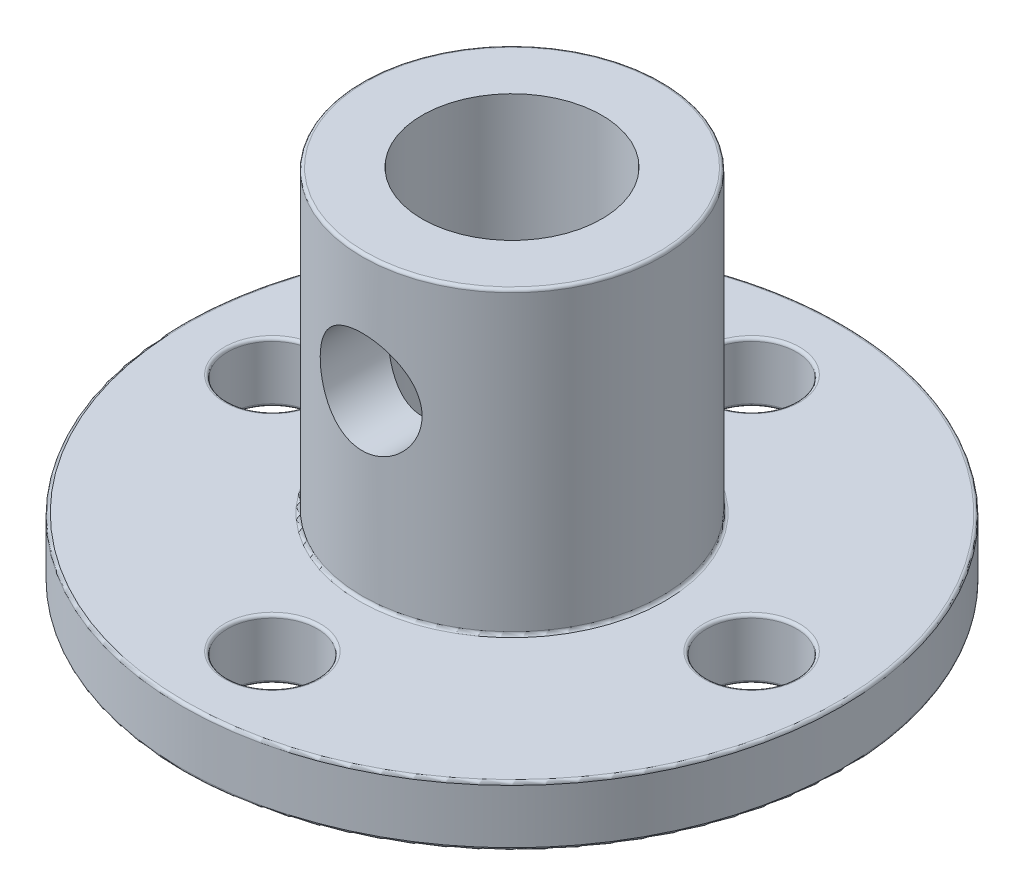
ISO-10303-21;
HEADER;
FILE_DESCRIPTION(('STEP AP214'),'2;1');
FILE_NAME('part.step','',(''),(''),'','','');
FILE_SCHEMA(('AUTOMOTIVE_DESIGN { 1 0 10303 214 1 1 1 1 }'));
ENDSEC;
DATA;
#1=APPLICATION_CONTEXT('core data for automotive mechanical design processes');
#2=APPLICATION_PROTOCOL_DEFINITION('international standard','automotive_design',2000,#1);
#3=PRODUCT_CONTEXT('',#1,'mechanical');
#4=PRODUCT('Part','Part','',(#3));
#5=PRODUCT_RELATED_PRODUCT_CATEGORY('part','',(#4));
#6=PRODUCT_DEFINITION_FORMATION('','',#4);
#7=PRODUCT_DEFINITION_CONTEXT('part definition',#1,'design');
#8=PRODUCT_DEFINITION('design','',#6,#7);
#9=PRODUCT_DEFINITION_SHAPE('','',#8);
#10=(LENGTH_UNIT() NAMED_UNIT(*) SI_UNIT(.MILLI.,.METRE.));
#11=(NAMED_UNIT(*) PLANE_ANGLE_UNIT() SI_UNIT($,.RADIAN.));
#12=(NAMED_UNIT(*) SI_UNIT($,.STERADIAN.) SOLID_ANGLE_UNIT());
#13=UNCERTAINTY_MEASURE_WITH_UNIT(LENGTH_MEASURE(1.E-05),#10,'distance_accuracy_value','');
#14=(GEOMETRIC_REPRESENTATION_CONTEXT(3) GLOBAL_UNCERTAINTY_ASSIGNED_CONTEXT((#13)) GLOBAL_UNIT_ASSIGNED_CONTEXT((#10,
#11,#12)) REPRESENTATION_CONTEXT('',''));
#15=CARTESIAN_POINT('',(0.,0.,0.));
#16=DIRECTION('',(0.,0.,1.));
#17=DIRECTION('',(1.,0.,0.));
#18=AXIS2_PLACEMENT_3D('',#15,#16,#17);
#19=CARTESIAN_POINT('',(0.,2.,0.));
#20=DIRECTION('',(0.,-1.,0.));
#21=DIRECTION('',(0.,0.,-1.));
#22=AXIS2_PLACEMENT_3D('',#19,#20,#21);
#23=CYLINDRICAL_SURFACE('',#22,11.);
#24=CARTESIAN_POINT('',(0.,0.1,0.));
#25=DIRECTION('',(0.,1.,0.));
#26=DIRECTION('',(0.,0.,1.));
#27=AXIS2_PLACEMENT_3D('',#24,#25,#26);
#28=CIRCLE('',#27,11.);
#29=CARTESIAN_POINT('',(0.,0.1,11.));
#30=VERTEX_POINT('',#29);
#31=EDGE_CURVE('E55',#30,#30,#28,.T.);
#32=ORIENTED_EDGE('',*,*,#31,.T.);
#33=EDGE_LOOP('',(#32));
#34=FACE_BOUND('',#33,.T.);
#35=CARTESIAN_POINT('',(0.,1.9,0.));
#36=DIRECTION('',(0.,1.,0.));
#37=DIRECTION('',(0.,0.,1.));
#38=AXIS2_PLACEMENT_3D('',#35,#36,#37);
#39=CIRCLE('',#38,11.);
#40=CARTESIAN_POINT('',(0.,1.9,11.));
#41=VERTEX_POINT('',#40);
#42=EDGE_CURVE('E61',#41,#41,#39,.F.);
#43=ORIENTED_EDGE('',*,*,#42,.T.);
#44=EDGE_LOOP('',(#43));
#45=FACE_BOUND('',#44,.T.);
#46=ADVANCED_FACE('F37',(#34,#45),#23,.T.);
#47=CARTESIAN_POINT('',(0.,2.,0.));
#48=DIRECTION('',(0.,1.,0.));
#49=DIRECTION('',(0.,0.,1.));
#50=AXIS2_PLACEMENT_3D('',#47,#48,#49);
#51=PLANE('',#50);
#52=CARTESIAN_POINT('',(0.,2.,-8.));
#53=DIRECTION('',(0.,1.,0.));
#54=DIRECTION('',(0.,0.,1.));
#55=AXIS2_PLACEMENT_3D('',#52,#53,#54);
#56=CIRCLE('',#55,1.6);
#57=CARTESIAN_POINT('',(0.,2.,-6.4));
#58=VERTEX_POINT('',#57);
#59=EDGE_CURVE('E109',#58,#58,#56,.F.);
#60=ORIENTED_EDGE('',*,*,#59,.T.);
#61=EDGE_LOOP('',(#60));
#62=FACE_BOUND('',#61,.T.);
#63=CARTESIAN_POINT('',(8.,2.,0.));
#64=DIRECTION('',(0.,1.,0.));
#65=DIRECTION('',(0.,0.,1.));
#66=AXIS2_PLACEMENT_3D('',#63,#64,#65);
#67=CIRCLE('',#66,1.6);
#68=CARTESIAN_POINT('',(8.,2.,1.60000000000008));
#69=VERTEX_POINT('',#68);
#70=EDGE_CURVE('E113',#69,#69,#67,.F.);
#71=ORIENTED_EDGE('',*,*,#70,.T.);
#72=EDGE_LOOP('',(#71));
#73=FACE_BOUND('',#72,.T.);
#74=CARTESIAN_POINT('',(0.,2.,8.));
#75=DIRECTION('',(0.,1.,0.));
#76=DIRECTION('',(0.,0.,1.));
#77=AXIS2_PLACEMENT_3D('',#74,#75,#76);
#78=CIRCLE('',#77,1.6);
#79=CARTESIAN_POINT('',(0.,2.,9.6));
#80=VERTEX_POINT('',#79);
#81=EDGE_CURVE('E117',#80,#80,#78,.F.);
#82=ORIENTED_EDGE('',*,*,#81,.T.);
#83=EDGE_LOOP('',(#82));
#84=FACE_BOUND('',#83,.T.);
#85=CARTESIAN_POINT('',(-8.,2.,0.));
#86=DIRECTION('',(0.,1.,0.));
#87=DIRECTION('',(0.,0.,1.));
#88=AXIS2_PLACEMENT_3D('',#85,#86,#87);
#89=CIRCLE('',#88,1.6);
#90=CARTESIAN_POINT('',(-8.,2.,1.59999999999997));
#91=VERTEX_POINT('',#90);
#92=EDGE_CURVE('E121',#91,#91,#89,.F.);
#93=ORIENTED_EDGE('',*,*,#92,.T.);
#94=EDGE_LOOP('',(#93));
#95=FACE_BOUND('',#94,.T.);
#96=CARTESIAN_POINT('',(0.,2.,0.));
#97=DIRECTION('',(0.,1.,0.));
#98=DIRECTION('',(0.,0.,1.));
#99=AXIS2_PLACEMENT_3D('',#96,#97,#98);
#100=CIRCLE('',#99,5.1);
#101=CARTESIAN_POINT('',(0.,2.,5.1));
#102=VERTEX_POINT('',#101);
#103=EDGE_CURVE('E125',#102,#102,#100,.F.);
#104=ORIENTED_EDGE('',*,*,#103,.T.);
#105=EDGE_LOOP('',(#104));
#106=FACE_BOUND('',#105,.T.);
#107=CARTESIAN_POINT('',(0.,2.,0.));
#108=DIRECTION('',(0.,1.,0.));
#109=DIRECTION('',(0.,0.,1.));
#110=AXIS2_PLACEMENT_3D('',#107,#108,#109);
#111=CIRCLE('',#110,10.9);
#112=CARTESIAN_POINT('',(0.,2.,10.9));
#113=VERTEX_POINT('',#112);
#114=EDGE_CURVE('E129',#113,#113,#111,.T.);
#115=ORIENTED_EDGE('',*,*,#114,.T.);
#116=EDGE_LOOP('',(#115));
#117=FACE_BOUND('',#116,.T.);
#118=ADVANCED_FACE('F203',(#62,#73,#84,#95,#106,#117),#51,.T.);
#119=CARTESIAN_POINT('',(0.,0.,0.));
#120=DIRECTION('',(0.,1.,0.));
#121=DIRECTION('',(0.,0.,1.));
#122=AXIS2_PLACEMENT_3D('',#119,#120,#121);
#123=PLANE('',#122);
#124=CARTESIAN_POINT('',(0.,0.,-8.));
#125=DIRECTION('',(0.,1.,0.));
#126=DIRECTION('',(0.,0.,1.));
#127=AXIS2_PLACEMENT_3D('',#124,#125,#126);
#128=CIRCLE('',#127,1.6);
#129=CARTESIAN_POINT('',(0.,0.,-6.4));
#130=VERTEX_POINT('',#129);
#131=EDGE_CURVE('E89',#130,#130,#128,.T.);
#132=ORIENTED_EDGE('',*,*,#131,.T.);
#133=EDGE_LOOP('',(#132));
#134=FACE_BOUND('',#133,.T.);
#135=CARTESIAN_POINT('',(8.,0.,0.));
#136=DIRECTION('',(0.,1.,0.));
#137=DIRECTION('',(0.,0.,1.));
#138=AXIS2_PLACEMENT_3D('',#135,#136,#137);
#139=CIRCLE('',#138,1.6);
#140=CARTESIAN_POINT('',(8.,0.,1.60000000000008));
#141=VERTEX_POINT('',#140);
#142=EDGE_CURVE('E93',#141,#141,#139,.T.);
#143=ORIENTED_EDGE('',*,*,#142,.T.);
#144=EDGE_LOOP('',(#143));
#145=FACE_BOUND('',#144,.T.);
#146=CARTESIAN_POINT('',(0.,0.,8.));
#147=DIRECTION('',(0.,1.,0.));
#148=DIRECTION('',(0.,0.,1.));
#149=AXIS2_PLACEMENT_3D('',#146,#147,#148);
#150=CIRCLE('',#149,1.6);
#151=CARTESIAN_POINT('',(0.,0.,9.6));
#152=VERTEX_POINT('',#151);
#153=EDGE_CURVE('E97',#152,#152,#150,.T.);
#154=ORIENTED_EDGE('',*,*,#153,.T.);
#155=EDGE_LOOP('',(#154));
#156=FACE_BOUND('',#155,.T.);
#157=CARTESIAN_POINT('',(-8.,0.,0.));
#158=DIRECTION('',(0.,1.,0.));
#159=DIRECTION('',(0.,0.,1.));
#160=AXIS2_PLACEMENT_3D('',#157,#158,#159);
#161=CIRCLE('',#160,1.6);
#162=CARTESIAN_POINT('',(-8.,0.,1.59999999999997));
#163=VERTEX_POINT('',#162);
#164=EDGE_CURVE('E101',#163,#163,#161,.T.);
#165=ORIENTED_EDGE('',*,*,#164,.T.);
#166=EDGE_LOOP('',(#165));
#167=FACE_BOUND('',#166,.T.);
#168=CARTESIAN_POINT('',(0.,0.,0.));
#169=DIRECTION('',(0.,1.,0.));
#170=DIRECTION('',(0.,0.,1.));
#171=AXIS2_PLACEMENT_3D('',#168,#169,#170);
#172=CIRCLE('',#171,10.9);
#173=CARTESIAN_POINT('',(0.,0.,10.9));
#174=VERTEX_POINT('',#173);
#175=EDGE_CURVE('E105',#174,#174,#172,.F.);
#176=ORIENTED_EDGE('',*,*,#175,.T.);
#177=EDGE_LOOP('',(#176));
#178=FACE_BOUND('',#177,.T.);
#179=CARTESIAN_POINT('',(0.,0.,0.));
#180=DIRECTION('',(0.,1.,0.));
#181=DIRECTION('',(0.,0.,1.));
#182=AXIS2_PLACEMENT_3D('',#179,#180,#181);
#183=CIRCLE('',#182,3.);
#184=CARTESIAN_POINT('',(0.,0.,3.));
#185=VERTEX_POINT('',#184);
#186=EDGE_CURVE('E141',#185,#185,#183,.T.);
#187=ORIENTED_EDGE('',*,*,#186,.T.);
#188=EDGE_LOOP('',(#187));
#189=FACE_BOUND('',#188,.T.);
#190=ADVANCED_FACE('F199',(#134,#145,#156,#167,#178,#189),#123,.F.);
#191=CARTESIAN_POINT('',(0.,12.,0.));
#192=DIRECTION('',(0.,-1.,0.));
#193=DIRECTION('',(0.,0.,-1.));
#194=AXIS2_PLACEMENT_3D('',#191,#192,#193);
#195=CYLINDRICAL_SURFACE('',#194,5.);
#196=CARTESIAN_POINT('',(1.69999999999999,8.,4.7021271782035));
#197=CARTESIAN_POINT('',(1.70000083454375,7.90752328975831,4.70212652194256));
#198=CARTESIAN_POINT('',(1.69242870923651,7.81505224444068,4.70488508126443));
#199=CARTESIAN_POINT('',(1.66244775059742,7.6328572377474,4.71556097706198));
#200=CARTESIAN_POINT('',(1.64003696400668,7.54313363965373,4.72347899269067));
#201=CARTESIAN_POINT('',(1.58126291046388,7.36910391544352,4.7434754891435));
#202=CARTESIAN_POINT('',(1.54492788897221,7.28478722293931,4.75554554247406));
#203=CARTESIAN_POINT('',(1.45943386286845,7.12341804583153,4.78247366817093));
#204=CARTESIAN_POINT('',(1.41027185367261,7.04636726895504,4.79733239352443));
#205=CARTESIAN_POINT('',(1.2983746719467,6.89857913546177,4.82884222933476));
#206=CARTESIAN_POINT('',(1.23520476543085,6.82818065203456,4.84553930456831));
#207=CARTESIAN_POINT('',(1.09801191148952,6.69874435129835,4.87845678431022));
#208=CARTESIAN_POINT('',(1.02398714442389,6.63970844258409,4.8946771083507));
#209=CARTESIAN_POINT('',(0.864693432862369,6.5331212255404,4.92534783339618));
#210=CARTESIAN_POINT('',(0.779172907362995,6.48592700656457,4.93973790593414));
#211=CARTESIAN_POINT('',(0.600833256277233,6.4067295955546,4.96458352458178));
#212=CARTESIAN_POINT('',(0.508016191005185,6.37472213308829,4.97504017657606));
#213=CARTESIAN_POINT('',(0.321272723570076,6.32796192600481,4.99051509444579));
#214=CARTESIAN_POINT('',(0.227507209637129,6.31262822616442,4.99571598750179));
#215=CARTESIAN_POINT('',(0.0385994725331013,6.2978014121833,5.00074274740375));
#216=CARTESIAN_POINT('',(-0.0565423749459008,6.29830405387371,5.00057005438089));
#217=CARTESIAN_POINT('',(-0.241382097771989,6.31477175114398,4.99499170747059));
#218=CARTESIAN_POINT('',(-0.331143746450025,6.3301053455759,4.98979976393553));
#219=CARTESIAN_POINT('',(-0.506734255470696,6.3747527069175,4.9750364341854));
#220=CARTESIAN_POINT('',(-0.59256284621597,6.40406743061818,4.96546474824686));
#221=CARTESIAN_POINT('',(-0.75920656134227,6.47620165201555,4.9427500710043));
#222=CARTESIAN_POINT('',(-0.839939033628107,6.51919695472472,4.92956091559001));
#223=CARTESIAN_POINT('',(-0.993226636814275,6.61732550429228,4.90097842010093));
#224=CARTESIAN_POINT('',(-1.06577942162155,6.67246222021983,4.88558445050251));
#225=CARTESIAN_POINT('',(-1.20439996959723,6.79646981206153,4.85332192905628));
#226=CARTESIAN_POINT('',(-1.26997767595032,6.86588010712957,4.83641807912284));
#227=CARTESIAN_POINT('',(-1.38872493069964,7.01485104493052,4.80367011822786));
#228=CARTESIAN_POINT('',(-1.44189240256894,7.09441338290158,4.78782618493151));
#229=CARTESIAN_POINT('',(-1.53502589229707,7.26303997150578,4.75879407140505));
#230=CARTESIAN_POINT('',(-1.57477659354932,7.35223139968969,4.74565042127558));
#231=CARTESIAN_POINT('',(-1.63852535861583,7.536602288434,4.72402172661412));
#232=CARTESIAN_POINT('',(-1.66253034568802,7.63177909707254,4.71553463490143));
#233=CARTESIAN_POINT('',(-1.69309083890646,7.82065603849394,4.70464619656837));
#234=CARTESIAN_POINT('',(-1.70040916615749,7.91421742410798,4.70197905671105));
#235=CARTESIAN_POINT('',(-1.69955565307547,8.10124961809406,4.70228801878616));
#236=CARTESIAN_POINT('',(-1.6913867740242,8.19472044036349,4.70526304189047));
#237=CARTESIAN_POINT('',(-1.66047724893075,8.37538355218379,4.71625534392992));
#238=CARTESIAN_POINT('',(-1.63827542017045,8.46268061675481,4.72408598154745));
#239=CARTESIAN_POINT('',(-1.58058151574919,8.63228971501207,4.74369940014614));
#240=CARTESIAN_POINT('',(-1.54508702470011,8.71460083955142,4.75548289935478));
#241=CARTESIAN_POINT('',(-1.46049899203864,8.87488375226898,4.78215067653987));
#242=CARTESIAN_POINT('',(-1.4109989860438,8.95262586296178,4.79712369407796));
#243=CARTESIAN_POINT('',(-1.30026121895316,9.09897548811651,4.82831489840599));
#244=CARTESIAN_POINT('',(-1.23901986418284,9.16758019497026,4.84453346550791));
#245=CARTESIAN_POINT('',(-1.10287590057702,9.29728191788624,4.8773765903905));
#246=CARTESIAN_POINT('',(-1.02744048224684,9.35782657762009,4.89398043774981));
#247=CARTESIAN_POINT('',(-0.867071356511241,9.46543835734577,4.92492097197535));
#248=CARTESIAN_POINT('',(-0.782137944357915,9.51250589612193,4.93925772928231));
#249=CARTESIAN_POINT('',(-0.605562992499803,9.59140881407607,4.96398853333037));
#250=CARTESIAN_POINT('',(-0.513967041076656,9.62333820506572,4.97440682887351));
#251=CARTESIAN_POINT('',(-0.326279600958924,9.67120054667826,4.99022992286064));
#252=CARTESIAN_POINT('',(-0.230189822477591,9.68713953173943,4.99563661251921));
#253=CARTESIAN_POINT('',(-0.0412847320444337,9.70200838968725,5.00067886842801));
#254=CARTESIAN_POINT('',(0.0514617684068306,9.70172977552556,5.00058299503759));
#255=CARTESIAN_POINT('',(0.235524998701214,9.68613660256515,4.99529808648695));
#256=CARTESIAN_POINT('',(0.326841851834332,9.670823347662,4.99010949299845));
#257=CARTESIAN_POINT('',(0.503894933746095,9.62612656364102,4.97532468724919));
#258=CARTESIAN_POINT('',(0.589699849092416,9.59698787569877,4.96580528761005));
#259=CARTESIAN_POINT('',(0.755232625464402,9.52569632870286,4.94333981389634));
#260=CARTESIAN_POINT('',(0.834959370027396,9.48354108586364,4.93039311222516));
#261=CARTESIAN_POINT('',(0.989365962188499,9.38557875468782,4.90179107732748));
#262=CARTESIAN_POINT('',(1.06374043677656,9.32931521420284,4.88605174991667));
#263=CARTESIAN_POINT('',(1.20224900233287,9.20550072879636,4.85382976209564));
#264=CARTESIAN_POINT('',(1.26637974652637,9.13794610960774,4.83734686099555));
#265=CARTESIAN_POINT('',(1.38527108066895,8.9901427709675,4.80468376561511));
#266=CARTESIAN_POINT('',(1.43953691950701,8.90948580103271,4.78854400376067));
#267=CARTESIAN_POINT('',(1.53371304894745,8.73969115347826,4.75921932721247));
#268=CARTESIAN_POINT('',(1.57362636225987,8.65055526656511,4.74603379056559));
#269=CARTESIAN_POINT('',(1.63670315378203,8.46917424219347,4.72464649214224));
#270=CARTESIAN_POINT('',(1.66035870443536,8.37711798675454,4.71629964142924));
#271=CARTESIAN_POINT('',(1.69200369351248,8.19003839236571,4.70504136429291));
#272=CARTESIAN_POINT('',(1.6999991425389,8.09501620602082,4.70212785248597));
#273=CARTESIAN_POINT('',(1.69999999999999,8.,4.7021271782035));
#274=B_SPLINE_CURVE_WITH_KNOTS('',3,(#196,#197,#198,#199,#200,#201,#202,#203,#204,#205,#206,
#207,#208,#209,#210,#211,#212,#213,#214,#215,#216,#217,#218,#219,#220,#221,#222,#223,#224,#225,
#226,#227,#228,#229,#230,#231,#232,#233,#234,#235,#236,#237,#238,#239,#240,#241,#242,#243,#244,
#245,#246,#247,#248,#249,#250,#251,#252,#253,#254,#255,#256,#257,#258,#259,#260,#261,#262,#263,
#264,#265,#266,#267,#268,#269,#270,#271,#272,#273),.UNSPECIFIED.,.T.,.F.,(4,2,2,2,2,2,2,2,2,2,2,
2,2,2,2,2,2,2,2,2,2,2,2,2,2,2,2,2,2,2,2,2,2,2,2,2,2,2,4),(0.,0.277077968153845,
0.554192416190846,0.830747684942294,1.10736779203619,1.39421810283561,1.68111655449405,
1.97583876744143,2.27047805694105,2.55448535632962,2.83841654188374,3.11076776810837,
3.38313763521629,3.65915950263529,3.93526033814754,4.22485132673056,4.51449073608343,
4.8085789773331,5.10253782362637,5.38276332934061,5.66293525902721,5.93295361109327,
6.20302105158153,6.48191321620708,6.7608908780218,7.05392324511245,7.34694650560805,
7.63812537455788,7.92919431742889,8.20606990660463,8.48292148556452,8.75504342249778,
9.02721522404264,9.30969191167984,9.59226070059482,9.88646828974928,10.1806138810487,
10.4654099966659,10.750096781448),.UNSPECIFIED.);
#275=CARTESIAN_POINT('',(1.69999999999999,8.,4.7021271782035));
#276=VERTEX_POINT('',#275);
#277=EDGE_CURVE('E146',#276,#276,#274,.T.);
#278=ORIENTED_EDGE('',*,*,#277,.T.);
#279=EDGE_LOOP('',(#278));
#280=FACE_BOUND('',#279,.T.);
#281=CARTESIAN_POINT('',(0.,2.1,0.));
#282=DIRECTION('',(0.,1.,0.));
#283=DIRECTION('',(0.,0.,1.));
#284=AXIS2_PLACEMENT_3D('',#281,#282,#283);
#285=CIRCLE('',#284,5.);
#286=CARTESIAN_POINT('',(0.,2.1,5.));
#287=VERTEX_POINT('',#286);
#288=EDGE_CURVE('E45',#287,#287,#285,.T.);
#289=ORIENTED_EDGE('',*,*,#288,.T.);
#290=EDGE_LOOP('',(#289));
#291=FACE_BOUND('',#290,.T.);
#292=CARTESIAN_POINT('',(0.,11.9,0.));
#293=DIRECTION('',(0.,1.,0.));
#294=DIRECTION('',(0.,0.,1.));
#295=AXIS2_PLACEMENT_3D('',#292,#293,#294);
#296=CIRCLE('',#295,5.);
#297=CARTESIAN_POINT('',(0.,11.9,5.));
#298=VERTEX_POINT('',#297);
#299=EDGE_CURVE('E50',#298,#298,#296,.F.);
#300=ORIENTED_EDGE('',*,*,#299,.T.);
#301=EDGE_LOOP('',(#300));
#302=FACE_BOUND('',#301,.T.);
#303=ADVANCED_FACE('F163',(#280,#291,#302),#195,.T.);
#304=CARTESIAN_POINT('',(0.,12.,0.));
#305=DIRECTION('',(0.,1.,0.));
#306=DIRECTION('',(0.,0.,1.));
#307=AXIS2_PLACEMENT_3D('',#304,#305,#306);
#308=PLANE('',#307);
#309=CARTESIAN_POINT('',(0.,12.,0.));
#310=DIRECTION('',(0.,1.,0.));
#311=DIRECTION('',(0.,0.,1.));
#312=AXIS2_PLACEMENT_3D('',#309,#310,#311);
#313=CIRCLE('',#312,4.9);
#314=CARTESIAN_POINT('',(0.,12.,4.9));
#315=VERTEX_POINT('',#314);
#316=EDGE_CURVE('E10',#315,#315,#313,.T.);
#317=ORIENTED_EDGE('',*,*,#316,.T.);
#318=EDGE_LOOP('',(#317));
#319=FACE_BOUND('',#318,.T.);
#320=CARTESIAN_POINT('',(0.,12.,0.));
#321=DIRECTION('',(0.,1.,0.));
#322=DIRECTION('',(0.,0.,1.));
#323=AXIS2_PLACEMENT_3D('',#320,#321,#322);
#324=CIRCLE('',#323,3.);
#325=CARTESIAN_POINT('',(0.,12.,3.));
#326=VERTEX_POINT('',#325);
#327=EDGE_CURVE('E142',#326,#326,#324,.T.);
#328=ORIENTED_EDGE('',*,*,#327,.F.);
#329=EDGE_LOOP('',(#328));
#330=FACE_BOUND('',#329,.T.);
#331=ADVANCED_FACE('F193',(#319,#330),#308,.T.);
#332=CARTESIAN_POINT('',(0.,0.,0.));
#333=DIRECTION('',(0.,1.,0.));
#334=DIRECTION('',(0.,0.,1.));
#335=AXIS2_PLACEMENT_3D('',#332,#333,#334);
#336=CYLINDRICAL_SURFACE('',#335,3.);
#337=CARTESIAN_POINT('',(0.,6.30000000000001,3.));
#338=CARTESIAN_POINT('',(0.0877697488240708,6.30001001302128,2.99999133441048));
#339=CARTESIAN_POINT('',(0.175678642050409,6.30684452261692,2.99610484286383));
#340=CARTESIAN_POINT('',(0.348898565592619,6.33386701959559,2.98091941514981));
#341=CARTESIAN_POINT('',(0.434201989690228,6.35409079965466,2.96960061132579));
#342=CARTESIAN_POINT('',(0.599325942968553,6.40680126796895,2.94071411609451));
#343=CARTESIAN_POINT('',(0.679170429544019,6.43922968183566,2.9231761424651));
#344=CARTESIAN_POINT('',(0.832074166802577,6.51509473385691,2.88338392043332));
#345=CARTESIAN_POINT('',(0.905135493059388,6.55852798937859,2.86113112160237));
#346=CARTESIAN_POINT('',(1.04831230094814,6.6586535976658,2.81196934110111));
#347=CARTESIAN_POINT('',(1.11784339837088,6.71607206499214,2.78484117688452));
#348=CARTESIAN_POINT('',(1.24685685372676,6.84093944937979,2.7295212294157));
#349=CARTESIAN_POINT('',(1.30632738378244,6.90839999988891,2.70132824124799));
#350=CARTESIAN_POINT('',(1.41992297442561,7.05993788416209,2.64353840584554));
#351=CARTESIAN_POINT('',(1.47280545993795,7.14501959494441,2.61411150105205));
#352=CARTESIAN_POINT('',(1.56328720131685,7.32457475561624,2.56103499911283));
#353=CARTESIAN_POINT('',(1.60090930289245,7.4190339010446,2.53737678722681));
#354=CARTESIAN_POINT('',(1.65263595894521,7.59357691757067,2.50390264826699));
#355=CARTESIAN_POINT('',(1.67007871740791,7.67230803917536,2.49219376746819));
#356=CARTESIAN_POINT('',(1.69361701817459,7.8321609028987,2.47626182544848));
#357=CARTESIAN_POINT('',(1.69972442237451,7.9132800556231,2.47203093909219));
#358=CARTESIAN_POINT('',(1.70025764589358,8.07567685955261,2.47166423107446));
#359=CARTESIAN_POINT('',(1.69466851087201,8.15695458076414,2.47553877241856));
#360=CARTESIAN_POINT('',(1.67210703110484,8.31719988938576,2.49083036803125));
#361=CARTESIAN_POINT('',(1.65512697974366,8.39616587499947,2.50225252862359));
#362=CARTESIAN_POINT('',(1.61067074302858,8.54964871567647,2.53109280881299));
#363=CARTESIAN_POINT('',(1.58322166149742,8.62417648978703,2.54849543385258));
#364=CARTESIAN_POINT('',(1.51877579625947,8.76780475216444,2.5874184843333));
#365=CARTESIAN_POINT('',(1.48177533663828,8.83690313750868,2.60894049432213));
#366=CARTESIAN_POINT('',(1.39252660037394,8.97928498561182,2.65778923304395));
#367=CARTESIAN_POINT('',(1.33879365736397,9.05150872251174,2.6854960569743));
#368=CARTESIAN_POINT('',(1.22067884956637,9.18659326326084,2.74120648715254));
#369=CARTESIAN_POINT('',(1.15628810600204,9.24944617679779,2.76921032247429));
#370=CARTESIAN_POINT('',(1.01018443470598,9.37095327943349,2.82600742003748));
#371=CARTESIAN_POINT('',(0.927345136668144,9.42838475692861,2.85454857400247));
#372=CARTESIAN_POINT('',(0.751430238435182,9.52825408888865,2.90580846929353));
#373=CARTESIAN_POINT('',(0.658361243036541,9.57070154406952,2.92853093625589));
#374=CARTESIAN_POINT('',(0.471324413272136,9.63614459788286,2.96416437869922));
#375=CARTESIAN_POINT('',(0.377872223033322,9.6602906134547,2.97764923776691));
#376=CARTESIAN_POINT('',(0.187413154262453,9.69238779118732,2.99566244849969));
#377=CARTESIAN_POINT('',(0.0904097576028166,9.70035440569226,3.00019934591041));
#378=CARTESIAN_POINT('',(-0.0919259967895238,9.69966420910068,2.99981102609089));
#379=CARTESIAN_POINT('',(-0.177274920156345,9.69287099189619,2.99594654122011));
#380=CARTESIAN_POINT('',(-0.345393803623236,9.66671490599233,2.98124489000884));
#381=CARTESIAN_POINT('',(-0.42816370674112,9.64735175977263,2.97040756972135));
#382=CARTESIAN_POINT('',(-0.588304818397609,9.59715006524611,2.94286496071771));
#383=CARTESIAN_POINT('',(-0.665714686267076,9.56640678734121,2.92620845146431));
#384=CARTESIAN_POINT('',(-0.814340102402537,9.49454695712938,2.88837991117375));
#385=CARTESIAN_POINT('',(-0.885554104108606,9.45342782482212,2.86720675725647));
#386=CARTESIAN_POINT('',(-1.02772843144586,9.35716324727035,2.81956776700937));
#387=CARTESIAN_POINT('',(-1.0978940063197,9.30100449486271,2.7927806119577));
#388=CARTESIAN_POINT('',(-1.22834989449523,9.17863042528811,2.73791458360901));
#389=CARTESIAN_POINT('',(-1.28862885715301,9.11240371498034,2.70983427236239));
#390=CARTESIAN_POINT('',(-1.40423788816631,8.96330412373663,2.65192959309217));
#391=CARTESIAN_POINT('',(-1.45832500570601,8.87940523084769,2.62224568984065));
#392=CARTESIAN_POINT('',(-1.55146998658469,8.70209221954915,2.56823926470344));
#393=CARTESIAN_POINT('',(-1.59054828204758,8.60869125751054,2.54390947346438));
#394=CARTESIAN_POINT('',(-1.6452980416674,8.43522604973517,2.50874883027498));
#395=CARTESIAN_POINT('',(-1.66417578156714,8.35653362581215,2.49614951263489));
#396=CARTESIAN_POINT('',(-1.69054924119698,8.1964763695366,2.47836754939621));
#397=CARTESIAN_POINT('',(-1.6980574328103,8.11511456565394,2.47317677731618));
#398=CARTESIAN_POINT('',(-1.70128209488391,7.95189884494789,2.47096023336924));
#399=CARTESIAN_POINT('',(-1.69697770816998,7.87004431263477,2.47394890371389));
#400=CARTESIAN_POINT('',(-1.67679068401483,7.7084265114931,2.4876724871434));
#401=CARTESIAN_POINT('',(-1.66090067751291,7.62866460715243,2.49841233033588));
#402=CARTESIAN_POINT('',(-1.61862347234916,7.47427228872578,2.52600024321652));
#403=CARTESIAN_POINT('',(-1.59237324445538,7.39958925882284,2.54276836606381));
#404=CARTESIAN_POINT('',(-1.53031664329114,7.25549146088765,2.58059067537129));
#405=CARTESIAN_POINT('',(-1.49450668433325,7.18607868220772,2.60164646935733));
#406=CARTESIAN_POINT('',(-1.40800700170691,7.04317126120797,2.64958788852541));
#407=CARTESIAN_POINT('',(-1.35587801571102,6.97068107511502,2.67687243529276));
#408=CARTESIAN_POINT('',(-1.24105328475232,6.83479213487606,2.73200432741318));
#409=CARTESIAN_POINT('',(-1.17834866915541,6.77140109623583,2.75985212781088));
#410=CARTESIAN_POINT('',(-1.03531315283815,6.64793781447853,2.81686500519168));
#411=CARTESIAN_POINT('',(-0.953774872001283,6.58914359877583,2.84579668881543));
#412=CARTESIAN_POINT('',(-0.780252265387202,6.48627952292301,2.89816970384284));
#413=CARTESIAN_POINT('',(-0.688273752759521,6.44220152211232,2.92161406854795));
#414=CARTESIAN_POINT('',(-0.513420363400936,6.37719253527634,2.95684004933314));
#415=CARTESIAN_POINT('',(-0.431817393281163,6.35354491535033,2.9699517205938));
#416=CARTESIAN_POINT('',(-0.265357049293581,6.31870088252849,2.98940630538783));
#417=CARTESIAN_POINT('',(-0.180510058040848,6.30746770727996,2.99576920150795));
#418=CARTESIAN_POINT('',(-0.0635796404640882,6.30088853523745,2.99949727152824));
#419=CARTESIAN_POINT('',(-0.0317989523530342,6.29999637228555,3.00000313954036));
#420=CARTESIAN_POINT('',(0.,6.30000000000001,3.));
#421=B_SPLINE_CURVE_WITH_KNOTS('',3,(#337,#338,#339,#340,#341,#342,#343,#344,#345,#346,#347,
#348,#349,#350,#351,#352,#353,#354,#355,#356,#357,#358,#359,#360,#361,#362,#363,#364,#365,#366,
#367,#368,#369,#370,#371,#372,#373,#374,#375,#376,#377,#378,#379,#380,#381,#382,#383,#384,#385,
#386,#387,#388,#389,#390,#391,#392,#393,#394,#395,#396,#397,#398,#399,#400,#401,#402,#403,#404,
#405,#406,#407,#408,#409,#410,#411,#412,#413,#414,#415,#416,#417,#418,#419,#420),.UNSPECIFIED.,
.T.,.F.,(4,2,2,2,2,2,2,2,2,2,2,2,2,2,2,2,2,2,2,2,2,2,2,2,2,2,2,2,2,2,2,2,2,2,2,2,2,2,2,2,2,4),
(0.,0.263210544962749,0.527127570281854,0.789800117116267,1.05239202224804,1.33376412117951,
1.61546475508405,1.92714699952873,2.23836089938045,2.48175939909107,2.7249030502101,
2.96835775695075,3.21197734125908,3.45497044096423,3.6980571980427,3.97949646812438,
4.2611713901084,4.57383573562971,4.88629938247037,5.17696500716156,5.46735289713069,
5.72321969411434,5.97909214034643,6.232869250435,6.48670952557064,6.76691745867775,
7.04744487513933,7.35835310294567,7.66883656562136,7.91348107257087,8.15785702059685,
8.40266473460874,8.64762829512976,8.88945624817069,9.13137503438981,9.41036511208785,
9.68959037580457,10.0018215052174,10.3138796284996,10.570681448118,10.8267207569689,
10.9220818545022),.UNSPECIFIED.);
#422=CARTESIAN_POINT('',(0.,6.30000000000001,3.));
#423=VERTEX_POINT('',#422);
#424=EDGE_CURVE('E158',#423,#423,#421,.T.);
#425=ORIENTED_EDGE('',*,*,#424,.T.);
#426=EDGE_LOOP('',(#425));
#427=FACE_BOUND('',#426,.T.);
#428=ORIENTED_EDGE('',*,*,#186,.F.);
#429=EDGE_LOOP('',(#428));
#430=FACE_BOUND('',#429,.T.);
#431=ORIENTED_EDGE('',*,*,#327,.T.);
#432=EDGE_LOOP('',(#431));
#433=FACE_BOUND('',#432,.T.);
#434=ADVANCED_FACE('F190',(#427,#430,#433),#336,.F.);
#435=CARTESIAN_POINT('',(8.,0.,0.));
#436=DIRECTION('',(0.,1.,0.));
#437=DIRECTION('',(0.,0.,1.));
#438=AXIS2_PLACEMENT_3D('',#435,#436,#437);
#439=CYLINDRICAL_SURFACE('',#438,1.5);
#440=CARTESIAN_POINT('',(8.,1.9,0.));
#441=DIRECTION('',(0.,1.,0.));
#442=DIRECTION('',(0.,0.,1.));
#443=AXIS2_PLACEMENT_3D('',#440,#441,#442);
#444=CIRCLE('',#443,1.5);
#445=CARTESIAN_POINT('',(8.,1.9,1.50000000000008));
#446=VERTEX_POINT('',#445);
#447=EDGE_CURVE('E81',#446,#446,#444,.T.);
#448=ORIENTED_EDGE('',*,*,#447,.T.);
#449=EDGE_LOOP('',(#448));
#450=FACE_BOUND('',#449,.T.);
#451=CARTESIAN_POINT('',(8.,0.1,0.));
#452=DIRECTION('',(0.,1.,0.));
#453=DIRECTION('',(0.,0.,1.));
#454=AXIS2_PLACEMENT_3D('',#451,#452,#453);
#455=CIRCLE('',#454,1.5);
#456=CARTESIAN_POINT('',(8.,0.1,1.50000000000008));
#457=VERTEX_POINT('',#456);
#458=EDGE_CURVE('E85',#457,#457,#455,.F.);
#459=ORIENTED_EDGE('',*,*,#458,.T.);
#460=EDGE_LOOP('',(#459));
#461=FACE_BOUND('',#460,.T.);
#462=ADVANCED_FACE('F186',(#450,#461),#439,.F.);
#463=CARTESIAN_POINT('',(0.,0.,-8.));
#464=DIRECTION('',(0.,1.,0.));
#465=DIRECTION('',(0.,0.,1.));
#466=AXIS2_PLACEMENT_3D('',#463,#464,#465);
#467=CYLINDRICAL_SURFACE('',#466,1.5);
#468=CARTESIAN_POINT('',(0.,1.9,-8.));
#469=DIRECTION('',(0.,1.,0.));
#470=DIRECTION('',(0.,0.,1.));
#471=AXIS2_PLACEMENT_3D('',#468,#469,#470);
#472=CIRCLE('',#471,1.5);
#473=CARTESIAN_POINT('',(0.,1.9,-6.5));
#474=VERTEX_POINT('',#473);
#475=EDGE_CURVE('E133',#474,#474,#472,.T.);
#476=ORIENTED_EDGE('',*,*,#475,.T.);
#477=EDGE_LOOP('',(#476));
#478=FACE_BOUND('',#477,.T.);
#479=CARTESIAN_POINT('',(0.,0.1,-8.));
#480=DIRECTION('',(0.,1.,0.));
#481=DIRECTION('',(0.,0.,1.));
#482=AXIS2_PLACEMENT_3D('',#479,#480,#481);
#483=CIRCLE('',#482,1.5);
#484=CARTESIAN_POINT('',(0.,0.1,-6.5));
#485=VERTEX_POINT('',#484);
#486=EDGE_CURVE('E137',#485,#485,#483,.F.);
#487=ORIENTED_EDGE('',*,*,#486,.T.);
#488=EDGE_LOOP('',(#487));
#489=FACE_BOUND('',#488,.T.);
#490=ADVANCED_FACE('F182',(#478,#489),#467,.F.);
#491=CARTESIAN_POINT('',(-8.,0.,0.));
#492=DIRECTION('',(0.,1.,0.));
#493=DIRECTION('',(0.,0.,1.));
#494=AXIS2_PLACEMENT_3D('',#491,#492,#493);
#495=CYLINDRICAL_SURFACE('',#494,1.5);
#496=CARTESIAN_POINT('',(-8.,1.9,0.));
#497=DIRECTION('',(0.,1.,0.));
#498=DIRECTION('',(0.,0.,1.));
#499=AXIS2_PLACEMENT_3D('',#496,#497,#498);
#500=CIRCLE('',#499,1.5);
#501=CARTESIAN_POINT('',(-8.,1.9,1.49999999999997));
#502=VERTEX_POINT('',#501);
#503=EDGE_CURVE('E65',#502,#502,#500,.T.);
#504=ORIENTED_EDGE('',*,*,#503,.T.);
#505=EDGE_LOOP('',(#504));
#506=FACE_BOUND('',#505,.T.);
#507=CARTESIAN_POINT('',(-8.,0.1,0.));
#508=DIRECTION('',(0.,1.,0.));
#509=DIRECTION('',(0.,0.,1.));
#510=AXIS2_PLACEMENT_3D('',#507,#508,#509);
#511=CIRCLE('',#510,1.5);
#512=CARTESIAN_POINT('',(-8.,0.1,1.49999999999997));
#513=VERTEX_POINT('',#512);
#514=EDGE_CURVE('E69',#513,#513,#511,.F.);
#515=ORIENTED_EDGE('',*,*,#514,.T.);
#516=EDGE_LOOP('',(#515));
#517=FACE_BOUND('',#516,.T.);
#518=ADVANCED_FACE('F178',(#506,#517),#495,.F.);
#519=CARTESIAN_POINT('',(0.,0.,8.));
#520=DIRECTION('',(0.,1.,0.));
#521=DIRECTION('',(0.,0.,1.));
#522=AXIS2_PLACEMENT_3D('',#519,#520,#521);
#523=CYLINDRICAL_SURFACE('',#522,1.5);
#524=CARTESIAN_POINT('',(0.,1.9,8.));
#525=DIRECTION('',(0.,1.,0.));
#526=DIRECTION('',(0.,0.,1.));
#527=AXIS2_PLACEMENT_3D('',#524,#525,#526);
#528=CIRCLE('',#527,1.5);
#529=CARTESIAN_POINT('',(0.,1.9,9.5));
#530=VERTEX_POINT('',#529);
#531=EDGE_CURVE('E73',#530,#530,#528,.T.);
#532=ORIENTED_EDGE('',*,*,#531,.T.);
#533=EDGE_LOOP('',(#532));
#534=FACE_BOUND('',#533,.T.);
#535=CARTESIAN_POINT('',(0.,0.1,8.));
#536=DIRECTION('',(0.,1.,0.));
#537=DIRECTION('',(0.,0.,1.));
#538=AXIS2_PLACEMENT_3D('',#535,#536,#537);
#539=CIRCLE('',#538,1.5);
#540=CARTESIAN_POINT('',(0.,0.1,9.5));
#541=VERTEX_POINT('',#540);
#542=EDGE_CURVE('E77',#541,#541,#539,.F.);
#543=ORIENTED_EDGE('',*,*,#542,.T.);
#544=EDGE_LOOP('',(#543));
#545=FACE_BOUND('',#544,.T.);
#546=ADVANCED_FACE('F174',(#534,#545),#523,.F.);
#547=CARTESIAN_POINT('',(0.,1.9,-8.));
#548=DIRECTION('',(0.,1.,0.));
#549=DIRECTION('',(0.,0.,1.));
#550=AXIS2_PLACEMENT_3D('',#547,#548,#549);
#551=TOROIDAL_SURFACE('',#550,1.6,0.1);
#552=ORIENTED_EDGE('',*,*,#59,.F.);
#553=EDGE_LOOP('',(#552));
#554=FACE_BOUND('',#553,.T.);
#555=ORIENTED_EDGE('',*,*,#475,.F.);
#556=EDGE_LOOP('',(#555));
#557=FACE_BOUND('',#556,.T.);
#558=ADVANCED_FACE('F177',(#554,#557),#551,.T.);
#559=CARTESIAN_POINT('',(0.,0.1,-8.));
#560=DIRECTION('',(0.,1.,0.));
#561=DIRECTION('',(0.,0.,1.));
#562=AXIS2_PLACEMENT_3D('',#559,#560,#561);
#563=TOROIDAL_SURFACE('',#562,1.6,0.1);
#564=ORIENTED_EDGE('',*,*,#486,.F.);
#565=EDGE_LOOP('',(#564));
#566=FACE_BOUND('',#565,.T.);
#567=ORIENTED_EDGE('',*,*,#131,.F.);
#568=EDGE_LOOP('',(#567));
#569=FACE_BOUND('',#568,.T.);
#570=ADVANCED_FACE('F215',(#566,#569),#563,.T.);
#571=CARTESIAN_POINT('',(8.,1.9,0.));
#572=DIRECTION('',(0.,1.,0.));
#573=DIRECTION('',(0.,0.,1.));
#574=AXIS2_PLACEMENT_3D('',#571,#572,#573);
#575=TOROIDAL_SURFACE('',#574,1.6,0.1);
#576=ORIENTED_EDGE('',*,*,#70,.F.);
#577=EDGE_LOOP('',(#576));
#578=FACE_BOUND('',#577,.T.);
#579=ORIENTED_EDGE('',*,*,#447,.F.);
#580=EDGE_LOOP('',(#579));
#581=FACE_BOUND('',#580,.T.);
#582=ADVANCED_FACE('F219',(#578,#581),#575,.T.);
#583=CARTESIAN_POINT('',(8.,0.1,0.));
#584=DIRECTION('',(0.,1.,0.));
#585=DIRECTION('',(0.,0.,1.));
#586=AXIS2_PLACEMENT_3D('',#583,#584,#585);
#587=TOROIDAL_SURFACE('',#586,1.6,0.1);
#588=ORIENTED_EDGE('',*,*,#458,.F.);
#589=EDGE_LOOP('',(#588));
#590=FACE_BOUND('',#589,.T.);
#591=ORIENTED_EDGE('',*,*,#142,.F.);
#592=EDGE_LOOP('',(#591));
#593=FACE_BOUND('',#592,.T.);
#594=ADVANCED_FACE('F223',(#590,#593),#587,.T.);
#595=CARTESIAN_POINT('',(0.,1.9,8.));
#596=DIRECTION('',(0.,1.,0.));
#597=DIRECTION('',(0.,0.,1.));
#598=AXIS2_PLACEMENT_3D('',#595,#596,#597);
#599=TOROIDAL_SURFACE('',#598,1.6,0.1);
#600=ORIENTED_EDGE('',*,*,#81,.F.);
#601=EDGE_LOOP('',(#600));
#602=FACE_BOUND('',#601,.T.);
#603=ORIENTED_EDGE('',*,*,#531,.F.);
#604=EDGE_LOOP('',(#603));
#605=FACE_BOUND('',#604,.T.);
#606=ADVANCED_FACE('F227',(#602,#605),#599,.T.);
#607=CARTESIAN_POINT('',(0.,0.1,8.));
#608=DIRECTION('',(0.,1.,0.));
#609=DIRECTION('',(0.,0.,1.));
#610=AXIS2_PLACEMENT_3D('',#607,#608,#609);
#611=TOROIDAL_SURFACE('',#610,1.6,0.1);
#612=ORIENTED_EDGE('',*,*,#542,.F.);
#613=EDGE_LOOP('',(#612));
#614=FACE_BOUND('',#613,.T.);
#615=ORIENTED_EDGE('',*,*,#153,.F.);
#616=EDGE_LOOP('',(#615));
#617=FACE_BOUND('',#616,.T.);
#618=ADVANCED_FACE('F231',(#614,#617),#611,.T.);
#619=CARTESIAN_POINT('',(-8.,1.9,0.));
#620=DIRECTION('',(0.,1.,0.));
#621=DIRECTION('',(0.,0.,1.));
#622=AXIS2_PLACEMENT_3D('',#619,#620,#621);
#623=TOROIDAL_SURFACE('',#622,1.6,0.1);
#624=ORIENTED_EDGE('',*,*,#92,.F.);
#625=EDGE_LOOP('',(#624));
#626=FACE_BOUND('',#625,.T.);
#627=ORIENTED_EDGE('',*,*,#503,.F.);
#628=EDGE_LOOP('',(#627));
#629=FACE_BOUND('',#628,.T.);
#630=ADVANCED_FACE('F235',(#626,#629),#623,.T.);
#631=CARTESIAN_POINT('',(-8.,0.1,0.));
#632=DIRECTION('',(0.,1.,0.));
#633=DIRECTION('',(0.,0.,1.));
#634=AXIS2_PLACEMENT_3D('',#631,#632,#633);
#635=TOROIDAL_SURFACE('',#634,1.6,0.1);
#636=ORIENTED_EDGE('',*,*,#514,.F.);
#637=EDGE_LOOP('',(#636));
#638=FACE_BOUND('',#637,.T.);
#639=ORIENTED_EDGE('',*,*,#164,.F.);
#640=EDGE_LOOP('',(#639));
#641=FACE_BOUND('',#640,.T.);
#642=ADVANCED_FACE('F239',(#638,#641),#635,.T.);
#643=CARTESIAN_POINT('',(0.,0.1,0.));
#644=DIRECTION('',(0.,1.,0.));
#645=DIRECTION('',(0.,0.,1.));
#646=AXIS2_PLACEMENT_3D('',#643,#644,#645);
#647=TOROIDAL_SURFACE('',#646,10.9,0.1);
#648=ORIENTED_EDGE('',*,*,#175,.F.);
#649=EDGE_LOOP('',(#648));
#650=FACE_BOUND('',#649,.T.);
#651=ORIENTED_EDGE('',*,*,#31,.F.);
#652=EDGE_LOOP('',(#651));
#653=FACE_BOUND('',#652,.T.);
#654=ADVANCED_FACE('F243',(#650,#653),#647,.T.);
#655=CARTESIAN_POINT('',(0.,2.1,0.));
#656=DIRECTION('',(0.,1.,0.));
#657=DIRECTION('',(0.,0.,1.));
#658=AXIS2_PLACEMENT_3D('',#655,#656,#657);
#659=TOROIDAL_SURFACE('',#658,5.1,0.1);
#660=ORIENTED_EDGE('',*,*,#103,.F.);
#661=EDGE_LOOP('',(#660));
#662=FACE_BOUND('',#661,.T.);
#663=ORIENTED_EDGE('',*,*,#288,.F.);
#664=EDGE_LOOP('',(#663));
#665=FACE_BOUND('',#664,.T.);
#666=ADVANCED_FACE('F247',(#662,#665),#659,.F.);
#667=CARTESIAN_POINT('',(0.,1.9,0.));
#668=DIRECTION('',(0.,1.,0.));
#669=DIRECTION('',(0.,0.,1.));
#670=AXIS2_PLACEMENT_3D('',#667,#668,#669);
#671=TOROIDAL_SURFACE('',#670,10.9,0.1);
#672=ORIENTED_EDGE('',*,*,#42,.F.);
#673=EDGE_LOOP('',(#672));
#674=FACE_BOUND('',#673,.T.);
#675=ORIENTED_EDGE('',*,*,#114,.F.);
#676=EDGE_LOOP('',(#675));
#677=FACE_BOUND('',#676,.T.);
#678=ADVANCED_FACE('F250',(#674,#677),#671,.T.);
#679=CARTESIAN_POINT('',(0.,11.9,0.));
#680=DIRECTION('',(0.,1.,0.));
#681=DIRECTION('',(0.,0.,1.));
#682=AXIS2_PLACEMENT_3D('',#679,#680,#681);
#683=TOROIDAL_SURFACE('',#682,4.9,0.1);
#684=ORIENTED_EDGE('',*,*,#299,.F.);
#685=EDGE_LOOP('',(#684));
#686=FACE_BOUND('',#685,.T.);
#687=ORIENTED_EDGE('',*,*,#316,.F.);
#688=EDGE_LOOP('',(#687));
#689=FACE_BOUND('',#688,.T.);
#690=ADVANCED_FACE('F39',(#686,#689),#683,.T.);
#691=CARTESIAN_POINT('',(0.,8.,5.));
#692=DIRECTION('',(0.,0.,1.));
#693=DIRECTION('',(1.,0.,0.));
#694=AXIS2_PLACEMENT_3D('',#691,#692,#693);
#695=CYLINDRICAL_SURFACE('',#694,1.69999999999999);
#696=ORIENTED_EDGE('',*,*,#424,.F.);
#697=EDGE_LOOP('',(#696));
#698=FACE_BOUND('',#697,.T.);
#699=ORIENTED_EDGE('',*,*,#277,.F.);
#700=EDGE_LOOP('',(#699));
#701=FACE_BOUND('',#700,.T.);
#702=ADVANCED_FACE('F167',(#698,#701),#695,.F.);
#703=CLOSED_SHELL('',(#46,#118,#190,#303,#331,#434,#462,#490,#518,#546,#558,#570,#582,#594,#606,
#618,#630,#642,#654,#666,#678,#690,#702));
#704=MANIFOLD_SOLID_BREP('B2',#703);
#705=ADVANCED_BREP_SHAPE_REPRESENTATION('',(#18,#704),#14);
#706=SHAPE_DEFINITION_REPRESENTATION(#9,#705);
ENDSEC;
END-ISO-10303-21;
